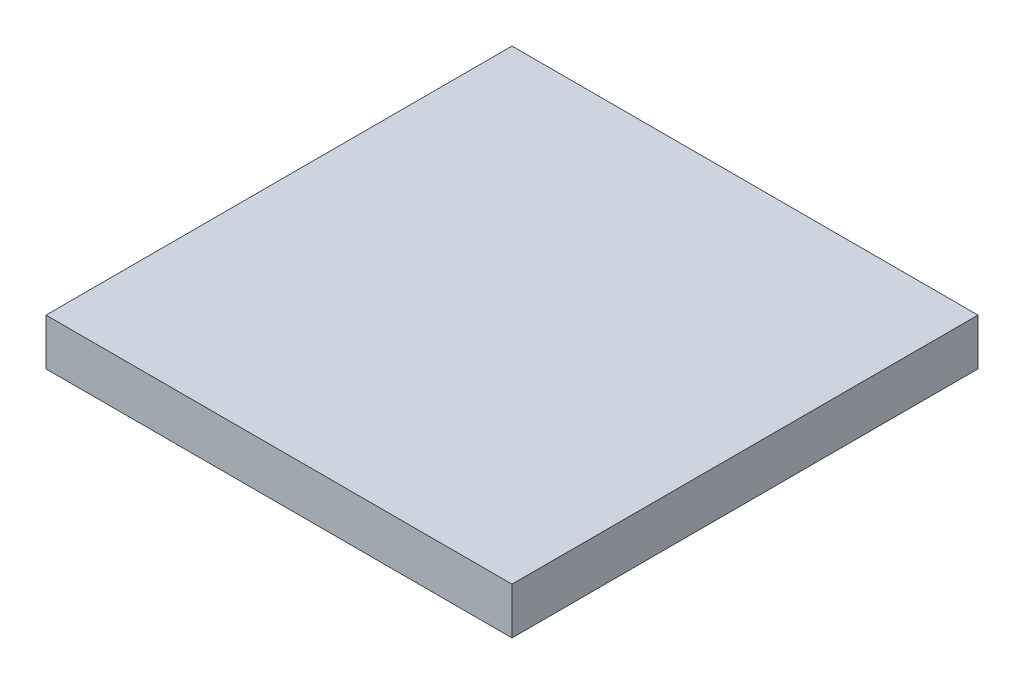
ISO-10303-21;
HEADER;
FILE_DESCRIPTION(('STEP AP214'),'2;1');
FILE_NAME('part.step','',(''),(''),'','','');
FILE_SCHEMA(('AUTOMOTIVE_DESIGN { 1 0 10303 214 1 1 1 1 }'));
ENDSEC;
DATA;
#1=APPLICATION_CONTEXT('core data for automotive mechanical design processes');
#2=APPLICATION_PROTOCOL_DEFINITION('international standard','automotive_design',2000,#1);
#3=PRODUCT_CONTEXT('',#1,'mechanical');
#4=PRODUCT('Part','Part','',(#3));
#5=PRODUCT_RELATED_PRODUCT_CATEGORY('part','',(#4));
#6=PRODUCT_DEFINITION_FORMATION('','',#4);
#7=PRODUCT_DEFINITION_CONTEXT('part definition',#1,'design');
#8=PRODUCT_DEFINITION('design','',#6,#7);
#9=PRODUCT_DEFINITION_SHAPE('','',#8);
#10=(LENGTH_UNIT() NAMED_UNIT(*) SI_UNIT(.MILLI.,.METRE.));
#11=(NAMED_UNIT(*) PLANE_ANGLE_UNIT() SI_UNIT($,.RADIAN.));
#12=(NAMED_UNIT(*) SI_UNIT($,.STERADIAN.) SOLID_ANGLE_UNIT());
#13=UNCERTAINTY_MEASURE_WITH_UNIT(LENGTH_MEASURE(1.E-05),#10,'distance_accuracy_value','');
#14=(GEOMETRIC_REPRESENTATION_CONTEXT(3) GLOBAL_UNCERTAINTY_ASSIGNED_CONTEXT((#13)) GLOBAL_UNIT_ASSIGNED_CONTEXT((#10,
#11,#12)) REPRESENTATION_CONTEXT('',''));
#15=CARTESIAN_POINT('',(0.,0.,0.));
#16=DIRECTION('',(0.,0.,1.));
#17=DIRECTION('',(1.,0.,0.));
#18=AXIS2_PLACEMENT_3D('',#15,#16,#17);
#19=CARTESIAN_POINT('',(75.,15.,75.));
#20=DIRECTION('',(-1.,0.,0.));
#21=DIRECTION('',(0.,0.,1.));
#22=AXIS2_PLACEMENT_3D('',#19,#20,#21);
#23=PLANE('',#22);
#24=DIRECTION('',(0.,0.,-1.));
#25=VECTOR('',#24,1.);
#26=CARTESIAN_POINT('',(75.,0.,75.));
#27=LINE('',#26,#25);
#28=CARTESIAN_POINT('',(75.,0.,75.));
#29=VERTEX_POINT('',#28);
#30=CARTESIAN_POINT('',(75.,0.,-75.));
#31=VERTEX_POINT('',#30);
#32=EDGE_CURVE('E99',#29,#31,#27,.T.);
#33=ORIENTED_EDGE('',*,*,#32,.T.);
#34=DIRECTION('',(0.,-1.,0.));
#35=VECTOR('',#34,1.);
#36=CARTESIAN_POINT('',(75.,15.,-75.));
#37=LINE('',#36,#35);
#38=CARTESIAN_POINT('',(75.,15.,-75.));
#39=VERTEX_POINT('',#38);
#40=EDGE_CURVE('E11',#39,#31,#37,.T.);
#41=ORIENTED_EDGE('',*,*,#40,.F.);
#42=DIRECTION('',(0.,0.,-1.));
#43=VECTOR('',#42,1.);
#44=CARTESIAN_POINT('',(75.,15.,75.));
#45=LINE('',#44,#43);
#46=CARTESIAN_POINT('',(75.,15.,75.));
#47=VERTEX_POINT('',#46);
#48=EDGE_CURVE('E87',#47,#39,#45,.T.);
#49=ORIENTED_EDGE('',*,*,#48,.F.);
#50=DIRECTION('',(0.,-1.,0.));
#51=VECTOR('',#50,1.);
#52=CARTESIAN_POINT('',(75.,15.,75.));
#53=LINE('',#52,#51);
#54=EDGE_CURVE('E95',#47,#29,#53,.T.);
#55=ORIENTED_EDGE('',*,*,#54,.T.);
#56=EDGE_LOOP('',(#33,#41,#49,#55));
#57=FACE_BOUND('',#56,.T.);
#58=ADVANCED_FACE('F36',(#57),#23,.F.);
#59=CARTESIAN_POINT('',(-75.,15.,-75.));
#60=DIRECTION('',(0.,0.,1.));
#61=DIRECTION('',(1.,0.,0.));
#62=AXIS2_PLACEMENT_3D('',#59,#60,#61);
#63=PLANE('',#62);
#64=DIRECTION('',(-1.,0.,0.));
#65=VECTOR('',#64,1.);
#66=CARTESIAN_POINT('',(-75.,0.,-75.));
#67=LINE('',#66,#65);
#68=CARTESIAN_POINT('',(-75.,0.,-75.));
#69=VERTEX_POINT('',#68);
#70=EDGE_CURVE('E91',#31,#69,#67,.T.);
#71=ORIENTED_EDGE('',*,*,#70,.T.);
#72=DIRECTION('',(0.,-1.,0.));
#73=VECTOR('',#72,1.);
#74=CARTESIAN_POINT('',(-75.,15.,-75.));
#75=LINE('',#74,#73);
#76=CARTESIAN_POINT('',(-75.,15.,-75.));
#77=VERTEX_POINT('',#76);
#78=EDGE_CURVE('E44',#77,#69,#75,.T.);
#79=ORIENTED_EDGE('',*,*,#78,.F.);
#80=DIRECTION('',(-1.,0.,0.));
#81=VECTOR('',#80,1.);
#82=CARTESIAN_POINT('',(-75.,15.,-75.));
#83=LINE('',#82,#81);
#84=EDGE_CURVE('E82',#39,#77,#83,.T.);
#85=ORIENTED_EDGE('',*,*,#84,.F.);
#86=ORIENTED_EDGE('',*,*,#40,.T.);
#87=EDGE_LOOP('',(#71,#79,#85,#86));
#88=FACE_BOUND('',#87,.T.);
#89=ADVANCED_FACE('F90',(#88),#63,.F.);
#90=CARTESIAN_POINT('',(-75.,15.,75.));
#91=DIRECTION('',(1.,0.,0.));
#92=DIRECTION('',(0.,0.,-1.));
#93=AXIS2_PLACEMENT_3D('',#90,#91,#92);
#94=PLANE('',#93);
#95=DIRECTION('',(0.,0.,1.));
#96=VECTOR('',#95,1.);
#97=CARTESIAN_POINT('',(-75.,0.,75.));
#98=LINE('',#97,#96);
#99=CARTESIAN_POINT('',(-75.,0.,75.));
#100=VERTEX_POINT('',#99);
#101=EDGE_CURVE('E69',#69,#100,#98,.T.);
#102=ORIENTED_EDGE('',*,*,#101,.T.);
#103=DIRECTION('',(0.,-1.,0.));
#104=VECTOR('',#103,1.);
#105=CARTESIAN_POINT('',(-75.,15.,75.));
#106=LINE('',#105,#104);
#107=CARTESIAN_POINT('',(-75.,15.,75.));
#108=VERTEX_POINT('',#107);
#109=EDGE_CURVE('E92',#108,#100,#106,.T.);
#110=ORIENTED_EDGE('',*,*,#109,.F.);
#111=DIRECTION('',(0.,0.,1.));
#112=VECTOR('',#111,1.);
#113=CARTESIAN_POINT('',(-75.,15.,75.));
#114=LINE('',#113,#112);
#115=EDGE_CURVE('E85',#77,#108,#114,.T.);
#116=ORIENTED_EDGE('',*,*,#115,.F.);
#117=ORIENTED_EDGE('',*,*,#78,.T.);
#118=EDGE_LOOP('',(#102,#110,#116,#117));
#119=FACE_BOUND('',#118,.T.);
#120=ADVANCED_FACE('F93',(#119),#94,.F.);
#121=CARTESIAN_POINT('',(-75.,15.,75.));
#122=DIRECTION('',(0.,0.,-1.));
#123=DIRECTION('',(-1.,0.,0.));
#124=AXIS2_PLACEMENT_3D('',#121,#122,#123);
#125=PLANE('',#124);
#126=DIRECTION('',(1.,0.,0.));
#127=VECTOR('',#126,1.);
#128=CARTESIAN_POINT('',(-75.,0.,75.));
#129=LINE('',#128,#127);
#130=EDGE_CURVE('E75',#100,#29,#129,.T.);
#131=ORIENTED_EDGE('',*,*,#130,.T.);
#132=ORIENTED_EDGE('',*,*,#54,.F.);
#133=DIRECTION('',(1.,0.,0.));
#134=VECTOR('',#133,1.);
#135=CARTESIAN_POINT('',(-75.,15.,75.));
#136=LINE('',#135,#134);
#137=EDGE_CURVE('E52',#108,#47,#136,.T.);
#138=ORIENTED_EDGE('',*,*,#137,.F.);
#139=ORIENTED_EDGE('',*,*,#109,.T.);
#140=EDGE_LOOP('',(#131,#132,#138,#139));
#141=FACE_BOUND('',#140,.T.);
#142=ADVANCED_FACE('F106',(#141),#125,.F.);
#143=CARTESIAN_POINT('',(0.,15.,0.));
#144=DIRECTION('',(0.,-1.,0.));
#145=DIRECTION('',(0.,0.,-1.));
#146=AXIS2_PLACEMENT_3D('',#143,#144,#145);
#147=PLANE('',#146);
#148=ORIENTED_EDGE('',*,*,#48,.T.);
#149=ORIENTED_EDGE('',*,*,#84,.T.);
#150=ORIENTED_EDGE('',*,*,#115,.T.);
#151=ORIENTED_EDGE('',*,*,#137,.T.);
#152=EDGE_LOOP('',(#148,#149,#150,#151));
#153=FACE_BOUND('',#152,.T.);
#154=ADVANCED_FACE('F83',(#153),#147,.F.);
#155=CARTESIAN_POINT('',(0.,0.,0.));
#156=DIRECTION('',(0.,-1.,0.));
#157=DIRECTION('',(0.,0.,-1.));
#158=AXIS2_PLACEMENT_3D('',#155,#156,#157);
#159=PLANE('',#158);
#160=ORIENTED_EDGE('',*,*,#32,.F.);
#161=ORIENTED_EDGE('',*,*,#130,.F.);
#162=ORIENTED_EDGE('',*,*,#101,.F.);
#163=ORIENTED_EDGE('',*,*,#70,.F.);
#164=EDGE_LOOP('',(#160,#161,#162,#163));
#165=FACE_BOUND('',#164,.T.);
#166=ADVANCED_FACE('F109',(#165),#159,.T.);
#167=CLOSED_SHELL('',(#58,#89,#120,#142,#154,#166));
#168=MANIFOLD_SOLID_BREP('B2',#167);
#169=ADVANCED_BREP_SHAPE_REPRESENTATION('',(#18,#168),#14);
#170=SHAPE_DEFINITION_REPRESENTATION(#9,#169);
ENDSEC;
END-ISO-10303-21;
